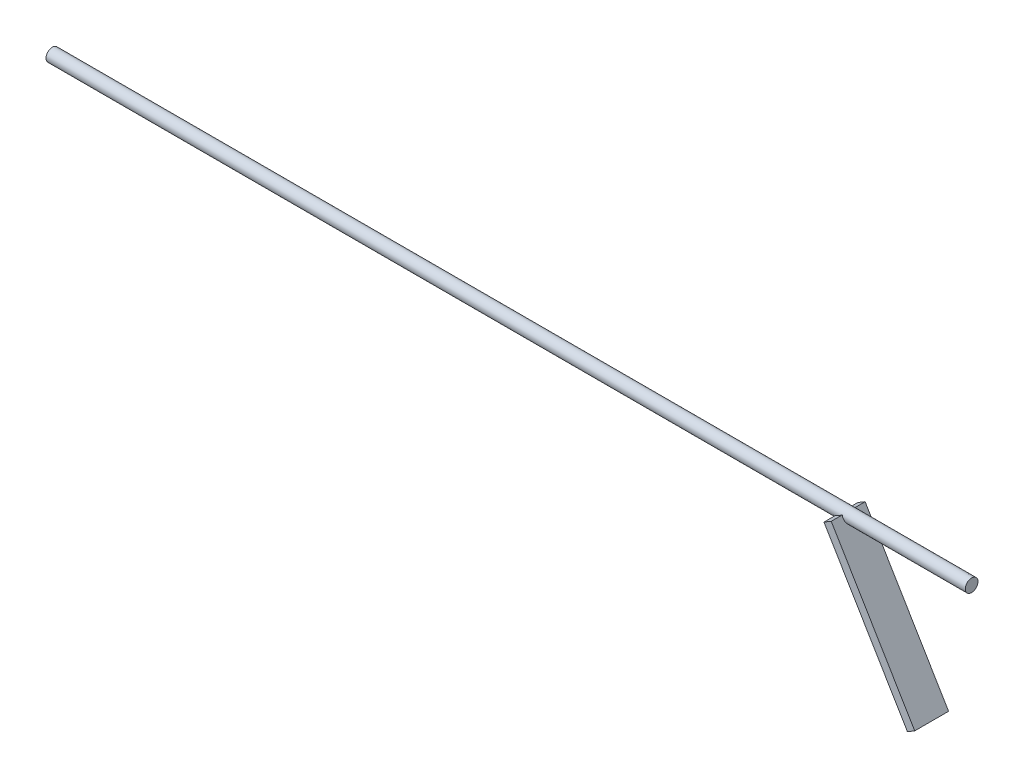
ISO-10303-21;
HEADER;
FILE_DESCRIPTION(('STEP AP214'),'2;1');
FILE_NAME('part.step','',(''),(''),'','','');
FILE_SCHEMA(('AUTOMOTIVE_DESIGN { 1 0 10303 214 1 1 1 1 }'));
ENDSEC;
DATA;
#1=APPLICATION_CONTEXT('core data for automotive mechanical design processes');
#2=APPLICATION_PROTOCOL_DEFINITION('international standard','automotive_design',2000,#1);
#3=PRODUCT_CONTEXT('',#1,'mechanical');
#4=PRODUCT('Part','Part','',(#3));
#5=PRODUCT_RELATED_PRODUCT_CATEGORY('part','',(#4));
#6=PRODUCT_DEFINITION_FORMATION('','',#4);
#7=PRODUCT_DEFINITION_CONTEXT('part definition',#1,'design');
#8=PRODUCT_DEFINITION('design','',#6,#7);
#9=PRODUCT_DEFINITION_SHAPE('','',#8);
#10=(LENGTH_UNIT() NAMED_UNIT(*) SI_UNIT(.MILLI.,.METRE.));
#11=(NAMED_UNIT(*) PLANE_ANGLE_UNIT() SI_UNIT($,.RADIAN.));
#12=(NAMED_UNIT(*) SI_UNIT($,.STERADIAN.) SOLID_ANGLE_UNIT());
#13=UNCERTAINTY_MEASURE_WITH_UNIT(LENGTH_MEASURE(1.E-05),#10,'distance_accuracy_value','');
#14=(GEOMETRIC_REPRESENTATION_CONTEXT(3) GLOBAL_UNCERTAINTY_ASSIGNED_CONTEXT((#13)) GLOBAL_UNIT_ASSIGNED_CONTEXT((#10,
#11,#12)) REPRESENTATION_CONTEXT('',''));
#15=CARTESIAN_POINT('',(0.,0.,0.));
#16=DIRECTION('',(0.,0.,1.));
#17=DIRECTION('',(1.,0.,0.));
#18=AXIS2_PLACEMENT_3D('',#15,#16,#17);
#19=CARTESIAN_POINT('',(20.,0.,0.));
#20=DIRECTION('',(-1.,0.,0.));
#21=DIRECTION('',(0.,0.,1.));
#22=AXIS2_PLACEMENT_3D('',#19,#20,#21);
#23=CYLINDRICAL_SURFACE('',#22,1.5);
#24=CARTESIAN_POINT('',(-197.,0.,0.));
#25=DIRECTION('',(1.,0.,0.));
#26=DIRECTION('',(0.,0.,-1.));
#27=AXIS2_PLACEMENT_3D('',#24,#25,#26);
#28=CIRCLE('',#27,1.5);
#29=CARTESIAN_POINT('',(-197.,0.,-1.5));
#30=VERTEX_POINT('',#29);
#31=EDGE_CURVE('E119',#30,#30,#28,.T.);
#32=ORIENTED_EDGE('',*,*,#31,.T.);
#33=EDGE_LOOP('',(#32));
#34=FACE_BOUND('',#33,.T.);
#35=CARTESIAN_POINT('',(20.,0.,0.));
#36=DIRECTION('',(1.,0.,0.));
#37=DIRECTION('',(0.,0.,-1.));
#38=AXIS2_PLACEMENT_3D('',#35,#36,#37);
#39=CIRCLE('',#38,1.5);
#40=CARTESIAN_POINT('',(20.,0.,-1.5));
#41=VERTEX_POINT('',#40);
#42=EDGE_CURVE('E118',#41,#41,#39,.T.);
#43=ORIENTED_EDGE('',*,*,#42,.F.);
#44=EDGE_LOOP('',(#43));
#45=FACE_BOUND('',#44,.T.);
#46=CARTESIAN_POINT('',(-10.,0.,0.));
#47=DIRECTION('',(0.51258128700483,-0.858638704119767,0.));
#48=DIRECTION('',(-0.858638704119766,-0.51258128700483,0.));
#49=AXIS2_PLACEMENT_3D('',#46,#47,#48);
#50=ELLIPSE('',#49,2.92636512106199,1.5);
#51=CARTESIAN_POINT('',(-10.8586387041198,-0.51258128700483,-1.40970224665086));
#52=VERTEX_POINT('',#51);
#53=CARTESIAN_POINT('',(-9.14136129588023,0.51258128700483,-1.40970224665086));
#54=VERTEX_POINT('',#53);
#55=EDGE_CURVE('E11',#52,#54,#50,.T.);
#56=ORIENTED_EDGE('',*,*,#55,.F.);
#57=CARTESIAN_POINT('',(-11.1646341996954,0.,0.));
#58=DIRECTION('',(0.858638704119766,0.51258128700483,0.));
#59=DIRECTION('',(-0.51258128700483,0.858638704119767,0.));
#60=AXIS2_PLACEMENT_3D('',#57,#58,#59);
#61=ELLIPSE('',#60,1.74695129954307,1.5);
#62=CARTESIAN_POINT('',(-10.8586387041198,-0.51258128700483,1.40970224665086));
#63=VERTEX_POINT('',#62);
#64=EDGE_CURVE('E42',#63,#52,#61,.T.);
#65=ORIENTED_EDGE('',*,*,#64,.F.);
#66=CARTESIAN_POINT('',(-9.14136129588023,0.51258128700483,1.40970224665086));
#67=VERTEX_POINT('',#66);
#68=EDGE_CURVE('E49',#67,#63,#50,.T.);
#69=ORIENTED_EDGE('',*,*,#68,.F.);
#70=CARTESIAN_POINT('',(-8.83536580030463,0.,0.));
#71=DIRECTION('',(-0.858638704119766,-0.51258128700483,0.));
#72=DIRECTION('',(-0.51258128700483,0.858638704119767,0.));
#73=AXIS2_PLACEMENT_3D('',#70,#71,#72);
#74=ELLIPSE('',#73,1.74695129954307,1.5);
#75=EDGE_CURVE('E58',#54,#67,#74,.T.);
#76=ORIENTED_EDGE('',*,*,#75,.F.);
#77=EDGE_LOOP('',(#56,#65,#69,#76));
#78=FACE_BOUND('',#77,.T.);
#79=ADVANCED_FACE('F41',(#34,#45,#78),#23,.T.);
#80=CARTESIAN_POINT('',(20.,0.,0.));
#81=DIRECTION('',(1.,0.,0.));
#82=DIRECTION('',(0.,0.,-1.));
#83=AXIS2_PLACEMENT_3D('',#80,#81,#82);
#84=PLANE('',#83);
#85=ORIENTED_EDGE('',*,*,#42,.T.);
#86=EDGE_LOOP('',(#85));
#87=FACE_BOUND('',#86,.T.);
#88=ADVANCED_FACE('F156',(#87),#84,.T.);
#89=CARTESIAN_POINT('',(-197.,0.,0.));
#90=DIRECTION('',(1.,0.,0.));
#91=DIRECTION('',(0.,0.,-1.));
#92=AXIS2_PLACEMENT_3D('',#89,#90,#91);
#93=PLANE('',#92);
#94=ORIENTED_EDGE('',*,*,#31,.F.);
#95=EDGE_LOOP('',(#94));
#96=FACE_BOUND('',#95,.T.);
#97=ADVANCED_FACE('F162',(#96),#93,.F.);
#98=CARTESIAN_POINT('',(-10.8586387041198,-0.51258128700483,4.));
#99=DIRECTION('',(0.51258128700483,-0.858638704119767,0.));
#100=DIRECTION('',(0.858638704119767,0.51258128700483,0.));
#101=AXIS2_PLACEMENT_3D('',#98,#99,#100);
#102=PLANE('',#101);
#103=DIRECTION('',(0.,0.,-1.));
#104=VECTOR('',#103,1.);
#105=CARTESIAN_POINT('',(-10.8586387041198,-0.51258128700483,4.));
#106=LINE('',#105,#104);
#107=CARTESIAN_POINT('',(-10.8586387041198,-0.51258128700483,-4.));
#108=VERTEX_POINT('',#107);
#109=EDGE_CURVE('E131',#52,#108,#106,.T.);
#110=ORIENTED_EDGE('',*,*,#109,.F.);
#111=ORIENTED_EDGE('',*,*,#55,.T.);
#112=DIRECTION('',(0.,0.,-1.));
#113=VECTOR('',#112,1.);
#114=CARTESIAN_POINT('',(-9.14136129588023,0.51258128700483,4.));
#115=LINE('',#114,#113);
#116=CARTESIAN_POINT('',(-9.14136129588023,0.51258128700483,-4.));
#117=VERTEX_POINT('',#116);
#118=EDGE_CURVE('E138',#54,#117,#115,.T.);
#119=ORIENTED_EDGE('',*,*,#118,.T.);
#120=DIRECTION('',(-0.858638704119767,-0.51258128700483,0.));
#121=VECTOR('',#120,1.);
#122=CARTESIAN_POINT('',(-10.8586387041198,-0.51258128700483,-4.));
#123=LINE('',#122,#121);
#124=EDGE_CURVE('E112',#117,#108,#123,.T.);
#125=ORIENTED_EDGE('',*,*,#124,.T.);
#126=EDGE_LOOP('',(#110,#111,#119,#125));
#127=FACE_BOUND('',#126,.T.);
#128=ADVANCED_FACE('F139',(#127),#102,.F.);
#129=CARTESIAN_POINT('',(8.84136129588023,-33.5125812870048,4.));
#130=DIRECTION('',(0.858638704119766,0.51258128700483,0.));
#131=DIRECTION('',(-0.51258128700483,0.858638704119767,0.));
#132=AXIS2_PLACEMENT_3D('',#129,#130,#131);
#133=PLANE('',#132);
#134=CARTESIAN_POINT('',(-10.8586387041198,-0.51258128700483,4.));
#135=VERTEX_POINT('',#134);
#136=EDGE_CURVE('E133',#135,#63,#106,.T.);
#137=ORIENTED_EDGE('',*,*,#136,.T.);
#138=ORIENTED_EDGE('',*,*,#64,.T.);
#139=ORIENTED_EDGE('',*,*,#109,.T.);
#140=DIRECTION('',(0.51258128700483,-0.858638704119766,0.));
#141=VECTOR('',#140,1.);
#142=CARTESIAN_POINT('',(8.84136129588023,-33.5125812870048,-4.));
#143=LINE('',#142,#141);
#144=CARTESIAN_POINT('',(8.84136129588023,-33.5125812870048,-4.));
#145=VERTEX_POINT('',#144);
#146=EDGE_CURVE('E113',#108,#145,#143,.T.);
#147=ORIENTED_EDGE('',*,*,#146,.T.);
#148=DIRECTION('',(0.,0.,-1.));
#149=VECTOR('',#148,1.);
#150=CARTESIAN_POINT('',(8.84136129588023,-33.5125812870048,4.));
#151=LINE('',#150,#149);
#152=CARTESIAN_POINT('',(8.84136129588023,-33.5125812870048,4.));
#153=VERTEX_POINT('',#152);
#154=EDGE_CURVE('E92',#153,#145,#151,.T.);
#155=ORIENTED_EDGE('',*,*,#154,.F.);
#156=DIRECTION('',(0.51258128700483,-0.858638704119766,0.));
#157=VECTOR('',#156,1.);
#158=CARTESIAN_POINT('',(8.84136129588023,-33.5125812870048,4.));
#159=LINE('',#158,#157);
#160=EDGE_CURVE('E105',#135,#153,#159,.T.);
#161=ORIENTED_EDGE('',*,*,#160,.F.);
#162=EDGE_LOOP('',(#137,#138,#139,#147,#155,#161));
#163=FACE_BOUND('',#162,.T.);
#164=ADVANCED_FACE('F114',(#163),#133,.F.);
#165=CARTESIAN_POINT('',(10.5586387041198,-32.4874187129952,4.));
#166=DIRECTION('',(-0.512581287004829,0.858638704119768,0.));
#167=DIRECTION('',(-0.858638704119768,-0.512581287004829,0.));
#168=AXIS2_PLACEMENT_3D('',#165,#166,#167);
#169=PLANE('',#168);
#170=DIRECTION('',(0.858638704119768,0.512581287004829,0.));
#171=VECTOR('',#170,1.);
#172=CARTESIAN_POINT('',(10.5586387041198,-32.4874187129952,-4.));
#173=LINE('',#172,#171);
#174=CARTESIAN_POINT('',(10.5586387041198,-32.4874187129952,-4.));
#175=VERTEX_POINT('',#174);
#176=EDGE_CURVE('E149',#145,#175,#173,.T.);
#177=ORIENTED_EDGE('',*,*,#176,.T.);
#178=DIRECTION('',(0.,0.,-1.));
#179=VECTOR('',#178,1.);
#180=CARTESIAN_POINT('',(10.5586387041198,-32.4874187129952,4.));
#181=LINE('',#180,#179);
#182=CARTESIAN_POINT('',(10.5586387041198,-32.4874187129952,4.));
#183=VERTEX_POINT('',#182);
#184=EDGE_CURVE('E98',#183,#175,#181,.T.);
#185=ORIENTED_EDGE('',*,*,#184,.F.);
#186=DIRECTION('',(0.858638704119768,0.512581287004829,0.));
#187=VECTOR('',#186,1.);
#188=CARTESIAN_POINT('',(10.5586387041198,-32.4874187129952,4.));
#189=LINE('',#188,#187);
#190=EDGE_CURVE('E93',#153,#183,#189,.T.);
#191=ORIENTED_EDGE('',*,*,#190,.F.);
#192=ORIENTED_EDGE('',*,*,#154,.T.);
#193=EDGE_LOOP('',(#177,#185,#191,#192));
#194=FACE_BOUND('',#193,.T.);
#195=ADVANCED_FACE('F91',(#194),#169,.F.);
#196=CARTESIAN_POINT('',(-9.14136129588023,0.51258128700483,4.));
#197=DIRECTION('',(-0.858638704119766,-0.51258128700483,0.));
#198=DIRECTION('',(0.51258128700483,-0.858638704119767,0.));
#199=AXIS2_PLACEMENT_3D('',#196,#197,#198);
#200=PLANE('',#199);
#201=ORIENTED_EDGE('',*,*,#118,.F.);
#202=ORIENTED_EDGE('',*,*,#75,.T.);
#203=CARTESIAN_POINT('',(-9.14136129588023,0.51258128700483,4.));
#204=VERTEX_POINT('',#203);
#205=EDGE_CURVE('E124',#204,#67,#115,.T.);
#206=ORIENTED_EDGE('',*,*,#205,.F.);
#207=DIRECTION('',(-0.51258128700483,0.858638704119766,0.));
#208=VECTOR('',#207,1.);
#209=CARTESIAN_POINT('',(-9.14136129588023,0.51258128700483,4.));
#210=LINE('',#209,#208);
#211=EDGE_CURVE('E101',#183,#204,#210,.T.);
#212=ORIENTED_EDGE('',*,*,#211,.F.);
#213=ORIENTED_EDGE('',*,*,#184,.T.);
#214=DIRECTION('',(-0.51258128700483,0.858638704119766,0.));
#215=VECTOR('',#214,1.);
#216=CARTESIAN_POINT('',(-9.14136129588023,0.51258128700483,-4.));
#217=LINE('',#216,#215);
#218=EDGE_CURVE('E148',#175,#117,#217,.T.);
#219=ORIENTED_EDGE('',*,*,#218,.T.);
#220=EDGE_LOOP('',(#201,#202,#206,#212,#213,#219));
#221=FACE_BOUND('',#220,.T.);
#222=ADVANCED_FACE('F150',(#221),#200,.F.);
#223=ORIENTED_EDGE('',*,*,#205,.T.);
#224=ORIENTED_EDGE('',*,*,#68,.T.);
#225=ORIENTED_EDGE('',*,*,#136,.F.);
#226=DIRECTION('',(-0.858638704119767,-0.51258128700483,0.));
#227=VECTOR('',#226,1.);
#228=CARTESIAN_POINT('',(-10.8586387041198,-0.51258128700483,4.));
#229=LINE('',#228,#227);
#230=EDGE_CURVE('E110',#204,#135,#229,.T.);
#231=ORIENTED_EDGE('',*,*,#230,.F.);
#232=EDGE_LOOP('',(#223,#224,#225,#231));
#233=FACE_BOUND('',#232,.T.);
#234=ADVANCED_FACE('F152',(#233),#102,.F.);
#235=CARTESIAN_POINT('',(0.,0.,4.));
#236=DIRECTION('',(0.,0.,-1.));
#237=DIRECTION('',(-1.,0.,0.));
#238=AXIS2_PLACEMENT_3D('',#235,#236,#237);
#239=PLANE('',#238);
#240=ORIENTED_EDGE('',*,*,#160,.T.);
#241=ORIENTED_EDGE('',*,*,#190,.T.);
#242=ORIENTED_EDGE('',*,*,#211,.T.);
#243=ORIENTED_EDGE('',*,*,#230,.T.);
#244=EDGE_LOOP('',(#240,#241,#242,#243));
#245=FACE_BOUND('',#244,.T.);
#246=ADVANCED_FACE('F104',(#245),#239,.F.);
#247=CARTESIAN_POINT('',(0.,0.,-4.));
#248=DIRECTION('',(0.,0.,-1.));
#249=DIRECTION('',(-1.,0.,0.));
#250=AXIS2_PLACEMENT_3D('',#247,#248,#249);
#251=PLANE('',#250);
#252=ORIENTED_EDGE('',*,*,#146,.F.);
#253=ORIENTED_EDGE('',*,*,#124,.F.);
#254=ORIENTED_EDGE('',*,*,#218,.F.);
#255=ORIENTED_EDGE('',*,*,#176,.F.);
#256=EDGE_LOOP('',(#252,#253,#254,#255));
#257=FACE_BOUND('',#256,.T.);
#258=ADVANCED_FACE('F147',(#257),#251,.T.);
#259=CLOSED_SHELL('',(#79,#88,#97,#128,#164,#195,#222,#234,#246,#258));
#260=MANIFOLD_SOLID_BREP('B2',#259);
#261=ADVANCED_BREP_SHAPE_REPRESENTATION('',(#18,#260),#14);
#262=SHAPE_DEFINITION_REPRESENTATION(#9,#261);
ENDSEC;
END-ISO-10303-21;
